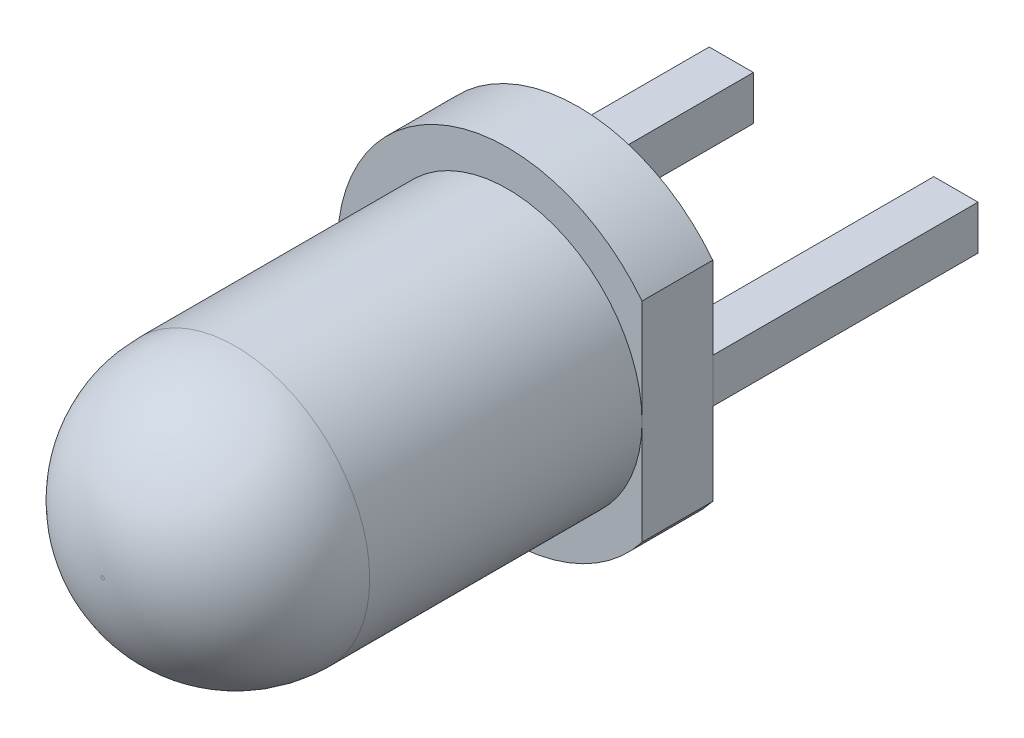
ISO-10303-21;
HEADER;
FILE_DESCRIPTION(('STEP AP214'),'2;1');
FILE_NAME('part.step','',(''),(''),'','','');
FILE_SCHEMA(('AUTOMOTIVE_DESIGN { 1 0 10303 214 1 1 1 1 }'));
ENDSEC;
DATA;
#1=APPLICATION_CONTEXT('core data for automotive mechanical design processes');
#2=APPLICATION_PROTOCOL_DEFINITION('international standard','automotive_design',2000,#1);
#3=PRODUCT_CONTEXT('',#1,'mechanical');
#4=PRODUCT('Part','Part','',(#3));
#5=PRODUCT_RELATED_PRODUCT_CATEGORY('part','',(#4));
#6=PRODUCT_DEFINITION_FORMATION('','',#4);
#7=PRODUCT_DEFINITION_CONTEXT('part definition',#1,'design');
#8=PRODUCT_DEFINITION('design','',#6,#7);
#9=PRODUCT_DEFINITION_SHAPE('','',#8);
#10=(LENGTH_UNIT() NAMED_UNIT(*) SI_UNIT(.MILLI.,.METRE.));
#11=(NAMED_UNIT(*) PLANE_ANGLE_UNIT() SI_UNIT($,.RADIAN.));
#12=(NAMED_UNIT(*) SI_UNIT($,.STERADIAN.) SOLID_ANGLE_UNIT());
#13=UNCERTAINTY_MEASURE_WITH_UNIT(LENGTH_MEASURE(1.E-05),#10,'distance_accuracy_value','');
#14=(GEOMETRIC_REPRESENTATION_CONTEXT(3) GLOBAL_UNCERTAINTY_ASSIGNED_CONTEXT((#13)) GLOBAL_UNIT_ASSIGNED_CONTEXT((#10,
#11,#12)) REPRESENTATION_CONTEXT('',''));
#15=CARTESIAN_POINT('',(0.,0.,0.));
#16=DIRECTION('',(0.,0.,1.));
#17=DIRECTION('',(1.,0.,0.));
#18=AXIS2_PLACEMENT_3D('',#15,#16,#17);
#19=CARTESIAN_POINT('',(0.,0.,5.39));
#20=DIRECTION('',(0.,0.,1.));
#21=DIRECTION('',(1.,0.,0.));
#22=AXIS2_PLACEMENT_3D('',#19,#20,#21);
#23=PLANE('',#22);
#24=CARTESIAN_POINT('',(0.,0.,5.39));
#25=DIRECTION('',(0.,0.,1.));
#26=DIRECTION('',(1.,0.,0.));
#27=AXIS2_PLACEMENT_3D('',#24,#25,#26);
#28=CIRCLE('',#27,0.02);
#29=CARTESIAN_POINT('',(0.02,0.,5.39));
#30=VERTEX_POINT('',#29);
#31=EDGE_CURVE('P0_E11',#30,#30,#28,.T.);
#32=ORIENTED_EDGE('',*,*,#31,.T.);
#33=EDGE_LOOP('',(#32));
#34=FACE_BOUND('',#33,.T.);
#35=ADVANCED_FACE('P0_F17',(#34),#23,.T.);
#36=CARTESIAN_POINT('',(1.52,0.,3.89));
#37=CARTESIAN_POINT('',(1.52,0.,4.125619449019));
#38=CARTESIAN_POINT('',(1.473746610581,0.,4.361242630973));
#39=CARTESIAN_POINT('',(1.381172946414,0.,4.584735226524));
#40=CARTESIAN_POINT('',(1.247268281961,0.,4.784052061599));
#41=CARTESIAN_POINT('',(0.914052061599,0.,5.117268281961));
#42=CARTESIAN_POINT('',(0.714735226524,0.,5.251172946414));
#43=CARTESIAN_POINT('',(0.491242630973,0.,5.343746610581));
#44=CARTESIAN_POINT('',(0.255619449019,0.,5.39));
#45=CARTESIAN_POINT('',(0.02,0.,5.39));
#46=(BOUNDED_CURVE() B_SPLINE_CURVE(5,(#36,#37,#38,#39,#40,#41,#42,#43,#44,#45),.UNSPECIFIED.,
.F.,.F.) B_SPLINE_CURVE_WITH_KNOTS((6,4,6),(0.,0.785398163397,1.570796326795),
.UNSPECIFIED.) CURVE() GEOMETRIC_REPRESENTATION_ITEM() RATIONAL_B_SPLINE_CURVE((1.,1.,1.,1.,1.,
1.,1.,1.,1.,1.)) REPRESENTATION_ITEM(''));
#47=CARTESIAN_POINT('',(0.,0.,3.89));
#48=DIRECTION('',(0.,0.,-1.));
#49=AXIS1_PLACEMENT('',#47,#48);
#50=SURFACE_OF_REVOLUTION('',#46,#49);
#51=CARTESIAN_POINT('',(0.02,0.,3.89));
#52=DIRECTION('',(0.,-1.,0.));
#53=DIRECTION('',(1.,0.,0.));
#54=AXIS2_PLACEMENT_3D('',#51,#52,#53);
#55=CIRCLE('',#54,1.5);
#56=CARTESIAN_POINT('',(1.52,0.,3.89));
#57=VERTEX_POINT('',#56);
#58=EDGE_CURVE('P0_E28',#57,#30,#55,.T.);
#59=ORIENTED_EDGE('',*,*,#58,.F.);
#60=CARTESIAN_POINT('',(0.,0.,3.89));
#61=DIRECTION('',(0.,0.,1.));
#62=DIRECTION('',(1.,0.,0.));
#63=AXIS2_PLACEMENT_3D('',#60,#61,#62);
#64=CIRCLE('',#63,1.52);
#65=EDGE_CURVE('P0_E239',#57,#57,#64,.T.);
#66=ORIENTED_EDGE('',*,*,#65,.T.);
#67=ORIENTED_EDGE('',*,*,#58,.T.);
#68=ORIENTED_EDGE('',*,*,#31,.F.);
#69=EDGE_LOOP('',(#59,#66,#67,#68));
#70=FACE_BOUND('',#69,.T.);
#71=ADVANCED_FACE('P0_F424',(#70),#50,.F.);
#72=CARTESIAN_POINT('',(0.04710743554143,0.,0.01));
#73=DIRECTION('',(0.,0.,-1.));
#74=DIRECTION('',(0.,-1.,0.));
#75=AXIS2_PLACEMENT_3D('',#72,#73,#74);
#76=PLANE('',#75);
#77=DIRECTION('',(1.,0.,0.));
#78=VECTOR('',#77,1.);
#79=CARTESIAN_POINT('',(-1.52,-0.25,0.01));
#80=LINE('',#79,#78);
#81=CARTESIAN_POINT('',(-1.52,-0.25,0.01));
#82=VERTEX_POINT('',#81);
#83=CARTESIAN_POINT('',(-1.02,-0.25,0.01));
#84=VERTEX_POINT('',#83);
#85=EDGE_CURVE('P0_E243',#82,#84,#80,.T.);
#86=ORIENTED_EDGE('',*,*,#85,.F.);
#87=DIRECTION('',(0.,-1.,0.));
#88=VECTOR('',#87,1.);
#89=CARTESIAN_POINT('',(-1.52,0.25,0.01));
#90=LINE('',#89,#88);
#91=CARTESIAN_POINT('',(-1.52,0.25,0.01));
#92=VERTEX_POINT('',#91);
#93=EDGE_CURVE('P0_E297',#92,#82,#90,.T.);
#94=ORIENTED_EDGE('',*,*,#93,.F.);
#95=DIRECTION('',(-1.,0.,0.));
#96=VECTOR('',#95,1.);
#97=CARTESIAN_POINT('',(-1.02,0.25,0.01));
#98=LINE('',#97,#96);
#99=CARTESIAN_POINT('',(-1.02,0.25,0.01));
#100=VERTEX_POINT('',#99);
#101=EDGE_CURVE('P0_E302',#100,#92,#98,.T.);
#102=ORIENTED_EDGE('',*,*,#101,.F.);
#103=DIRECTION('',(0.,1.,0.));
#104=VECTOR('',#103,1.);
#105=CARTESIAN_POINT('',(-1.02,-0.25,0.01));
#106=LINE('',#105,#104);
#107=EDGE_CURVE('P0_E284',#84,#100,#106,.T.);
#108=ORIENTED_EDGE('',*,*,#107,.F.);
#109=EDGE_LOOP('',(#86,#94,#102,#108));
#110=FACE_BOUND('',#109,.T.);
#111=ADVANCED_FACE('P0_F428',(#110),#76,.T.);
#112=CARTESIAN_POINT('',(0.,0.,0.81));
#113=DIRECTION('',(0.,0.,-1.));
#114=DIRECTION('',(1.,0.,0.));
#115=AXIS2_PLACEMENT_3D('',#112,#113,#114);
#116=CYLINDRICAL_SURFACE('',#115,1.52);
#117=CARTESIAN_POINT('',(0.,0.,0.81));
#118=DIRECTION('',(0.,0.,1.));
#119=DIRECTION('',(1.,0.,0.));
#120=AXIS2_PLACEMENT_3D('',#117,#118,#119);
#121=CIRCLE('',#120,1.52);
#122=CARTESIAN_POINT('',(1.52,0.,0.81));
#123=VERTEX_POINT('',#122);
#124=EDGE_CURVE('P0_E262',#123,#123,#121,.T.);
#125=ORIENTED_EDGE('',*,*,#124,.T.);
#126=DIRECTION('',(0.,0.,1.));
#127=VECTOR('',#126,1.);
#128=CARTESIAN_POINT('',(1.52,0.,0.81));
#129=LINE('',#128,#127);
#130=EDGE_CURVE('P0_E247',#123,#57,#129,.T.);
#131=ORIENTED_EDGE('',*,*,#130,.T.);
#132=ORIENTED_EDGE('',*,*,#65,.F.);
#133=ORIENTED_EDGE('',*,*,#130,.F.);
#134=EDGE_LOOP('',(#125,#131,#132,#133));
#135=FACE_BOUND('',#134,.T.);
#136=ADVANCED_FACE('P0_F453',(#135),#116,.T.);
#137=CARTESIAN_POINT('',(-1.52,-0.25,0.01));
#138=DIRECTION('',(0.,1.,0.));
#139=DIRECTION('',(1.,0.,0.));
#140=AXIS2_PLACEMENT_3D('',#137,#138,#139);
#141=PLANE('',#140);
#142=ORIENTED_EDGE('',*,*,#85,.T.);
#143=DIRECTION('',(0.,0.,1.));
#144=VECTOR('',#143,1.);
#145=CARTESIAN_POINT('',(-1.02,-0.25,0.01));
#146=LINE('',#145,#144);
#147=CARTESIAN_POINT('',(-1.02,-0.25,0.011));
#148=VERTEX_POINT('',#147);
#149=EDGE_CURVE('P0_E293',#84,#148,#146,.T.);
#150=ORIENTED_EDGE('',*,*,#149,.T.);
#151=DIRECTION('',(1.,0.,0.));
#152=VECTOR('',#151,1.);
#153=CARTESIAN_POINT('',(-1.52,-0.25,0.011));
#154=LINE('',#153,#152);
#155=CARTESIAN_POINT('',(-1.52,-0.25,0.011));
#156=VERTEX_POINT('',#155);
#157=EDGE_CURVE('P0_E193',#156,#148,#154,.T.);
#158=ORIENTED_EDGE('',*,*,#157,.F.);
#159=DIRECTION('',(0.,0.,1.));
#160=VECTOR('',#159,1.);
#161=CARTESIAN_POINT('',(-1.52,-0.25,0.01));
#162=LINE('',#161,#160);
#163=EDGE_CURVE('P0_E248',#82,#156,#162,.T.);
#164=ORIENTED_EDGE('',*,*,#163,.F.);
#165=EDGE_LOOP('',(#142,#150,#158,#164));
#166=FACE_BOUND('',#165,.T.);
#167=ADVANCED_FACE('P0_F479',(#166),#141,.F.);
#168=CARTESIAN_POINT('',(-1.52,0.25,0.01));
#169=DIRECTION('',(1.,0.,0.));
#170=DIRECTION('',(0.,1.,0.));
#171=AXIS2_PLACEMENT_3D('',#168,#169,#170);
#172=PLANE('',#171);
#173=ORIENTED_EDGE('',*,*,#93,.T.);
#174=ORIENTED_EDGE('',*,*,#163,.T.);
#175=DIRECTION('',(0.,-1.,0.));
#176=VECTOR('',#175,1.);
#177=CARTESIAN_POINT('',(-1.52,0.25,0.011));
#178=LINE('',#177,#176);
#179=CARTESIAN_POINT('',(-1.52,0.25,0.011));
#180=VERTEX_POINT('',#179);
#181=EDGE_CURVE('P0_E194',#180,#156,#178,.T.);
#182=ORIENTED_EDGE('',*,*,#181,.F.);
#183=DIRECTION('',(0.,0.,1.));
#184=VECTOR('',#183,1.);
#185=CARTESIAN_POINT('',(-1.52,0.25,0.01));
#186=LINE('',#185,#184);
#187=EDGE_CURVE('P0_E285',#92,#180,#186,.T.);
#188=ORIENTED_EDGE('',*,*,#187,.F.);
#189=EDGE_LOOP('',(#173,#174,#182,#188));
#190=FACE_BOUND('',#189,.T.);
#191=ADVANCED_FACE('P0_F436',(#190),#172,.F.);
#192=CARTESIAN_POINT('',(-1.02,-0.25,0.01));
#193=DIRECTION('',(-1.,0.,0.));
#194=DIRECTION('',(0.,0.,1.));
#195=AXIS2_PLACEMENT_3D('',#192,#193,#194);
#196=PLANE('',#195);
#197=ORIENTED_EDGE('',*,*,#107,.T.);
#198=DIRECTION('',(0.,0.,1.));
#199=VECTOR('',#198,1.);
#200=CARTESIAN_POINT('',(-1.02,0.25,0.01));
#201=LINE('',#200,#199);
#202=CARTESIAN_POINT('',(-1.02,0.25,0.011));
#203=VERTEX_POINT('',#202);
#204=EDGE_CURVE('P0_E56',#100,#203,#201,.T.);
#205=ORIENTED_EDGE('',*,*,#204,.T.);
#206=DIRECTION('',(0.,1.,0.));
#207=VECTOR('',#206,1.);
#208=CARTESIAN_POINT('',(-1.02,-0.25,0.011));
#209=LINE('',#208,#207);
#210=EDGE_CURVE('P0_E216',#148,#203,#209,.T.);
#211=ORIENTED_EDGE('',*,*,#210,.F.);
#212=ORIENTED_EDGE('',*,*,#149,.F.);
#213=EDGE_LOOP('',(#197,#205,#211,#212));
#214=FACE_BOUND('',#213,.T.);
#215=ADVANCED_FACE('P0_F432',(#214),#196,.F.);
#216=CARTESIAN_POINT('',(-1.02,0.25,0.01));
#217=DIRECTION('',(0.,-1.,0.));
#218=DIRECTION('',(0.,0.,-1.));
#219=AXIS2_PLACEMENT_3D('',#216,#217,#218);
#220=PLANE('',#219);
#221=ORIENTED_EDGE('',*,*,#101,.T.);
#222=ORIENTED_EDGE('',*,*,#187,.T.);
#223=DIRECTION('',(-1.,0.,0.));
#224=VECTOR('',#223,1.);
#225=CARTESIAN_POINT('',(-1.02,0.25,0.011));
#226=LINE('',#225,#224);
#227=EDGE_CURVE('P0_E254',#203,#180,#226,.T.);
#228=ORIENTED_EDGE('',*,*,#227,.F.);
#229=ORIENTED_EDGE('',*,*,#204,.F.);
#230=EDGE_LOOP('',(#221,#222,#228,#229));
#231=FACE_BOUND('',#230,.T.);
#232=ADVANCED_FACE('P0_F435',(#231),#220,.F.);
#233=CARTESIAN_POINT('',(0.04710743554143,0.,0.81));
#234=DIRECTION('',(0.,0.,-1.));
#235=DIRECTION('',(0.,-1.,0.));
#236=AXIS2_PLACEMENT_3D('',#233,#234,#235);
#237=PLANE('',#236);
#238=DIRECTION('',(0.,-1.,0.));
#239=VECTOR('',#238,1.);
#240=CARTESIAN_POINT('',(1.52,1.181196427357,0.81));
#241=LINE('',#240,#239);
#242=CARTESIAN_POINT('',(1.52,-1.181196427357,0.81));
#243=VERTEX_POINT('',#242);
#244=EDGE_CURVE('P0_E195',#123,#243,#241,.T.);
#245=ORIENTED_EDGE('',*,*,#244,.F.);
#246=ORIENTED_EDGE('',*,*,#124,.F.);
#247=DIRECTION('',(0.,-1.,0.));
#248=VECTOR('',#247,1.);
#249=CARTESIAN_POINT('',(1.52,1.181196427357,0.81));
#250=LINE('',#249,#248);
#251=CARTESIAN_POINT('',(1.52,1.181196427357,0.81));
#252=VERTEX_POINT('',#251);
#253=EDGE_CURVE('P0_E200',#252,#123,#250,.T.);
#254=ORIENTED_EDGE('',*,*,#253,.F.);
#255=CARTESIAN_POINT('',(0.,0.,0.81));
#256=DIRECTION('',(0.,0.,1.));
#257=DIRECTION('',(1.,0.,0.));
#258=AXIS2_PLACEMENT_3D('',#255,#256,#257);
#259=CIRCLE('',#258,1.925);
#260=EDGE_CURVE('P0_E235',#252,#243,#259,.T.);
#261=ORIENTED_EDGE('',*,*,#260,.T.);
#262=EDGE_LOOP('',(#245,#246,#254,#261));
#263=FACE_BOUND('',#262,.T.);
#264=ADVANCED_FACE('P0_F460',(#263),#237,.F.);
#265=CARTESIAN_POINT('',(-1.52,-0.349,0.011));
#266=DIRECTION('',(1.,0.,0.));
#267=DIRECTION('',(0.,0.,1.));
#268=AXIS2_PLACEMENT_3D('',#265,#266,#267);
#269=CYLINDRICAL_SURFACE('',#268,0.099);
#270=CARTESIAN_POINT('',(-1.619,-0.349,0.011));
#271=DIRECTION('',(-0.707106781186548,0.707106781186548,0.));
#272=DIRECTION('',(0.707106781186548,0.707106781186548,0.));
#273=AXIS2_PLACEMENT_3D('',#270,#271,#272);
#274=ELLIPSE('',#273,0.140007142675,0.099);
#275=CARTESIAN_POINT('',(-1.619,-0.349,0.11));
#276=VERTEX_POINT('',#275);
#277=EDGE_CURVE('P0_E189',#276,#156,#274,.T.);
#278=ORIENTED_EDGE('',*,*,#277,.T.);
#279=ORIENTED_EDGE('',*,*,#157,.T.);
#280=CARTESIAN_POINT('',(-0.921,-0.349,0.011));
#281=DIRECTION('',(-0.707106781186548,-0.707106781186548,0.));
#282=DIRECTION('',(-0.707106781186548,0.707106781186548,0.));
#283=AXIS2_PLACEMENT_3D('',#280,#281,#282);
#284=ELLIPSE('',#283,0.140007142675,0.099);
#285=CARTESIAN_POINT('',(-0.921,-0.349,0.11));
#286=VERTEX_POINT('',#285);
#287=EDGE_CURVE('P0_E209',#286,#148,#284,.T.);
#288=ORIENTED_EDGE('',*,*,#287,.F.);
#289=DIRECTION('',(1.,0.,0.));
#290=VECTOR('',#289,1.);
#291=CARTESIAN_POINT('',(-1.52,-0.349,0.11));
#292=LINE('',#291,#290);
#293=EDGE_CURVE('P0_E267',#276,#286,#292,.T.);
#294=ORIENTED_EDGE('',*,*,#293,.F.);
#295=EDGE_LOOP('',(#278,#279,#288,#294));
#296=FACE_BOUND('',#295,.T.);
#297=ADVANCED_FACE('P0_F457',(#296),#269,.F.);
#298=CARTESIAN_POINT('',(-1.619,0.25,0.011));
#299=DIRECTION('',(0.,-1.,0.));
#300=DIRECTION('',(0.,0.,1.));
#301=AXIS2_PLACEMENT_3D('',#298,#299,#300);
#302=CYLINDRICAL_SURFACE('',#301,0.099);
#303=CARTESIAN_POINT('',(-1.619,0.349,0.011));
#304=DIRECTION('',(0.707106781186548,0.707106781186548,0.));
#305=DIRECTION('',(-0.707106781186548,0.707106781186548,0.));
#306=AXIS2_PLACEMENT_3D('',#303,#304,#305);
#307=ELLIPSE('',#306,0.140007142675,0.099);
#308=CARTESIAN_POINT('',(-1.619,0.349,0.11));
#309=VERTEX_POINT('',#308);
#310=EDGE_CURVE('P0_E217',#309,#180,#307,.T.);
#311=ORIENTED_EDGE('',*,*,#310,.T.);
#312=ORIENTED_EDGE('',*,*,#181,.T.);
#313=ORIENTED_EDGE('',*,*,#277,.F.);
#314=DIRECTION('',(0.,-1.,0.));
#315=VECTOR('',#314,1.);
#316=CARTESIAN_POINT('',(-1.619,0.25,0.11));
#317=LINE('',#316,#315);
#318=EDGE_CURVE('P0_E271',#309,#276,#317,.T.);
#319=ORIENTED_EDGE('',*,*,#318,.F.);
#320=EDGE_LOOP('',(#311,#312,#313,#319));
#321=FACE_BOUND('',#320,.T.);
#322=ADVANCED_FACE('P0_F19',(#321),#302,.F.);
#323=CARTESIAN_POINT('',(-0.921,-0.25,0.011));
#324=DIRECTION('',(0.,1.,0.));
#325=DIRECTION('',(0.,0.,1.));
#326=AXIS2_PLACEMENT_3D('',#323,#324,#325);
#327=CYLINDRICAL_SURFACE('',#326,0.099);
#328=ORIENTED_EDGE('',*,*,#287,.T.);
#329=ORIENTED_EDGE('',*,*,#210,.T.);
#330=CARTESIAN_POINT('',(-0.921,0.349,0.011));
#331=DIRECTION('',(0.707106781186548,-0.707106781186548,0.));
#332=DIRECTION('',(-0.707106781186548,-0.707106781186548,0.));
#333=AXIS2_PLACEMENT_3D('',#330,#331,#332);
#334=ELLIPSE('',#333,0.140007142675,0.099);
#335=CARTESIAN_POINT('',(-0.921,0.349,0.11));
#336=VERTEX_POINT('',#335);
#337=EDGE_CURVE('P0_E258',#336,#203,#334,.T.);
#338=ORIENTED_EDGE('',*,*,#337,.F.);
#339=DIRECTION('',(0.,1.,0.));
#340=VECTOR('',#339,1.);
#341=CARTESIAN_POINT('',(-0.921,-0.25,0.11));
#342=LINE('',#341,#340);
#343=EDGE_CURVE('P0_E21',#286,#336,#342,.T.);
#344=ORIENTED_EDGE('',*,*,#343,.F.);
#345=EDGE_LOOP('',(#328,#329,#338,#344));
#346=FACE_BOUND('',#345,.T.);
#347=ADVANCED_FACE('P0_F475',(#346),#327,.F.);
#348=CARTESIAN_POINT('',(-1.02,0.349,0.011));
#349=DIRECTION('',(-1.,0.,0.));
#350=DIRECTION('',(0.,0.,1.));
#351=AXIS2_PLACEMENT_3D('',#348,#349,#350);
#352=CYLINDRICAL_SURFACE('',#351,0.099);
#353=ORIENTED_EDGE('',*,*,#337,.T.);
#354=ORIENTED_EDGE('',*,*,#227,.T.);
#355=ORIENTED_EDGE('',*,*,#310,.F.);
#356=DIRECTION('',(-1.,0.,0.));
#357=VECTOR('',#356,1.);
#358=CARTESIAN_POINT('',(-1.02,0.349,0.11));
#359=LINE('',#358,#357);
#360=EDGE_CURVE('P0_E272',#336,#309,#359,.T.);
#361=ORIENTED_EDGE('',*,*,#360,.F.);
#362=EDGE_LOOP('',(#353,#354,#355,#361));
#363=FACE_BOUND('',#362,.T.);
#364=ADVANCED_FACE('P0_F469',(#363),#352,.F.);
#365=CARTESIAN_POINT('',(0.921,-0.25,0.011));
#366=DIRECTION('',(0.,1.,0.));
#367=DIRECTION('',(1.,0.,0.));
#368=AXIS2_PLACEMENT_3D('',#365,#366,#367);
#369=CYLINDRICAL_SURFACE('',#368,0.099);
#370=CARTESIAN_POINT('',(0.921,-0.349,0.011));
#371=DIRECTION('',(0.707106781186548,-0.707106781186548,0.));
#372=DIRECTION('',(0.707106781186548,0.707106781186548,0.));
#373=AXIS2_PLACEMENT_3D('',#370,#371,#372);
#374=ELLIPSE('',#373,0.140007142675,0.099);
#375=CARTESIAN_POINT('',(1.02,-0.25,0.011));
#376=VERTEX_POINT('',#375);
#377=CARTESIAN_POINT('',(0.921,-0.349,0.11));
#378=VERTEX_POINT('',#377);
#379=EDGE_CURVE('P0_E263',#376,#378,#374,.T.);
#380=ORIENTED_EDGE('',*,*,#379,.T.);
#381=DIRECTION('',(0.,1.,0.));
#382=VECTOR('',#381,1.);
#383=CARTESIAN_POINT('',(0.921,-0.25,0.11));
#384=LINE('',#383,#382);
#385=CARTESIAN_POINT('',(0.921,0.349,0.11));
#386=VERTEX_POINT('',#385);
#387=EDGE_CURVE('P0_E358',#378,#386,#384,.T.);
#388=ORIENTED_EDGE('',*,*,#387,.T.);
#389=CARTESIAN_POINT('',(0.921,0.349,0.011));
#390=DIRECTION('',(-0.707106781186548,-0.707106781186548,0.));
#391=DIRECTION('',(-0.707106781186548,0.707106781186548,0.));
#392=AXIS2_PLACEMENT_3D('',#389,#390,#391);
#393=ELLIPSE('',#392,0.140007142675,0.099);
#394=CARTESIAN_POINT('',(1.02,0.25,0.011));
#395=VERTEX_POINT('',#394);
#396=EDGE_CURVE('P0_E72',#395,#386,#393,.T.);
#397=ORIENTED_EDGE('',*,*,#396,.F.);
#398=DIRECTION('',(0.,1.,0.));
#399=VECTOR('',#398,1.);
#400=CARTESIAN_POINT('',(1.02,-0.25,0.011));
#401=LINE('',#400,#399);
#402=EDGE_CURVE('P0_E266',#376,#395,#401,.T.);
#403=ORIENTED_EDGE('',*,*,#402,.F.);
#404=EDGE_LOOP('',(#380,#388,#397,#403));
#405=FACE_BOUND('',#404,.T.);
#406=ADVANCED_FACE('P0_F466',(#405),#369,.F.);
#407=CARTESIAN_POINT('',(1.02,0.349,0.011));
#408=DIRECTION('',(1.,0.,0.));
#409=DIRECTION('',(0.,-1.,0.));
#410=AXIS2_PLACEMENT_3D('',#407,#408,#409);
#411=CYLINDRICAL_SURFACE('',#410,0.099);
#412=ORIENTED_EDGE('',*,*,#396,.T.);
#413=DIRECTION('',(1.,0.,0.));
#414=VECTOR('',#413,1.);
#415=CARTESIAN_POINT('',(1.02,0.349,0.11));
#416=LINE('',#415,#414);
#417=CARTESIAN_POINT('',(1.321,0.349,0.11));
#418=VERTEX_POINT('',#417);
#419=EDGE_CURVE('P0_E187',#386,#418,#416,.T.);
#420=ORIENTED_EDGE('',*,*,#419,.T.);
#421=CARTESIAN_POINT('',(1.321,0.349,0.011));
#422=DIRECTION('',(-0.707106781186548,-0.707106781186548,0.));
#423=DIRECTION('',(-0.707106781186548,0.707106781186548,0.));
#424=AXIS2_PLACEMENT_3D('',#421,#422,#423);
#425=ELLIPSE('',#424,0.140007142675,0.099);
#426=CARTESIAN_POINT('',(1.42,0.25,0.011));
#427=VERTEX_POINT('',#426);
#428=EDGE_CURVE('P0_E281',#427,#418,#425,.T.);
#429=ORIENTED_EDGE('',*,*,#428,.F.);
#430=DIRECTION('',(1.,0.,0.));
#431=VECTOR('',#430,1.);
#432=CARTESIAN_POINT('',(1.02,0.25,0.011));
#433=LINE('',#432,#431);
#434=EDGE_CURVE('P0_E234',#395,#427,#433,.T.);
#435=ORIENTED_EDGE('',*,*,#434,.F.);
#436=EDGE_LOOP('',(#412,#420,#429,#435));
#437=FACE_BOUND('',#436,.T.);
#438=ADVANCED_FACE('P0_F444',(#437),#411,.F.);
#439=CARTESIAN_POINT('',(1.42,-0.349,0.011));
#440=DIRECTION('',(-1.,0.,0.));
#441=DIRECTION('',(0.,1.,0.));
#442=AXIS2_PLACEMENT_3D('',#439,#440,#441);
#443=CYLINDRICAL_SURFACE('',#442,0.099);
#444=CARTESIAN_POINT('',(1.321,-0.349,0.011));
#445=DIRECTION('',(0.707106781186548,-0.707106781186548,0.));
#446=DIRECTION('',(0.707106781186548,0.707106781186548,0.));
#447=AXIS2_PLACEMENT_3D('',#444,#445,#446);
#448=ELLIPSE('',#447,0.140007142675,0.099);
#449=CARTESIAN_POINT('',(1.42,-0.25,0.011));
#450=VERTEX_POINT('',#449);
#451=CARTESIAN_POINT('',(1.321,-0.349,0.11));
#452=VERTEX_POINT('',#451);
#453=EDGE_CURVE('P0_E249',#450,#452,#448,.T.);
#454=ORIENTED_EDGE('',*,*,#453,.T.);
#455=DIRECTION('',(-1.,0.,0.));
#456=VECTOR('',#455,1.);
#457=CARTESIAN_POINT('',(1.42,-0.349,0.11));
#458=LINE('',#457,#456);
#459=EDGE_CURVE('P0_E276',#452,#378,#458,.T.);
#460=ORIENTED_EDGE('',*,*,#459,.T.);
#461=ORIENTED_EDGE('',*,*,#379,.F.);
#462=DIRECTION('',(-1.,0.,0.));
#463=VECTOR('',#462,1.);
#464=CARTESIAN_POINT('',(1.42,-0.25,0.011));
#465=LINE('',#464,#463);
#466=EDGE_CURVE('P0_E253',#450,#376,#465,.T.);
#467=ORIENTED_EDGE('',*,*,#466,.F.);
#468=EDGE_LOOP('',(#454,#460,#461,#467));
#469=FACE_BOUND('',#468,.T.);
#470=ADVANCED_FACE('P0_F319',(#469),#443,.F.);
#471=CARTESIAN_POINT('',(1.02,-0.25,0.01));
#472=DIRECTION('',(-1.,0.,0.));
#473=DIRECTION('',(0.,0.,1.));
#474=AXIS2_PLACEMENT_3D('',#471,#472,#473);
#475=PLANE('',#474);
#476=DIRECTION('',(0.,0.,1.));
#477=VECTOR('',#476,1.);
#478=CARTESIAN_POINT('',(1.02,-0.25,0.01));
#479=LINE('',#478,#477);
#480=CARTESIAN_POINT('',(1.02,-0.25,0.01));
#481=VERTEX_POINT('',#480);
#482=EDGE_CURVE('P0_E289',#481,#376,#479,.T.);
#483=ORIENTED_EDGE('',*,*,#482,.T.);
#484=ORIENTED_EDGE('',*,*,#402,.T.);
#485=DIRECTION('',(0.,0.,1.));
#486=VECTOR('',#485,1.);
#487=CARTESIAN_POINT('',(1.02,0.25,0.01));
#488=LINE('',#487,#486);
#489=CARTESIAN_POINT('',(1.02,0.25,0.01));
#490=VERTEX_POINT('',#489);
#491=EDGE_CURVE('P0_E230',#490,#395,#488,.T.);
#492=ORIENTED_EDGE('',*,*,#491,.F.);
#493=DIRECTION('',(0.,1.,0.));
#494=VECTOR('',#493,1.);
#495=CARTESIAN_POINT('',(1.02,-0.25,0.01));
#496=LINE('',#495,#494);
#497=EDGE_CURVE('P0_E222',#481,#490,#496,.T.);
#498=ORIENTED_EDGE('',*,*,#497,.F.);
#499=EDGE_LOOP('',(#483,#484,#492,#498));
#500=FACE_BOUND('',#499,.T.);
#501=ADVANCED_FACE('P0_F309',(#500),#475,.T.);
#502=CARTESIAN_POINT('',(1.02,0.25,0.01));
#503=DIRECTION('',(0.,1.,0.));
#504=DIRECTION('',(1.,0.,0.));
#505=AXIS2_PLACEMENT_3D('',#502,#503,#504);
#506=PLANE('',#505);
#507=ORIENTED_EDGE('',*,*,#491,.T.);
#508=ORIENTED_EDGE('',*,*,#434,.T.);
#509=DIRECTION('',(0.,0.,1.));
#510=VECTOR('',#509,1.);
#511=CARTESIAN_POINT('',(1.42,0.25,0.01));
#512=LINE('',#511,#510);
#513=CARTESIAN_POINT('',(1.42,0.25,0.01));
#514=VERTEX_POINT('',#513);
#515=EDGE_CURVE('P0_E163',#514,#427,#512,.T.);
#516=ORIENTED_EDGE('',*,*,#515,.F.);
#517=DIRECTION('',(1.,0.,0.));
#518=VECTOR('',#517,1.);
#519=CARTESIAN_POINT('',(1.02,0.25,0.01));
#520=LINE('',#519,#518);
#521=EDGE_CURVE('P0_E159',#490,#514,#520,.T.);
#522=ORIENTED_EDGE('',*,*,#521,.F.);
#523=EDGE_LOOP('',(#507,#508,#516,#522));
#524=FACE_BOUND('',#523,.T.);
#525=ADVANCED_FACE('P0_F430',(#524),#506,.T.);
#526=CARTESIAN_POINT('',(0.,0.,0.01));
#527=DIRECTION('',(0.,0.,-1.));
#528=DIRECTION('',(1.,0.,0.));
#529=AXIS2_PLACEMENT_3D('',#526,#527,#528);
#530=CYLINDRICAL_SURFACE('',#529,1.925);
#531=CARTESIAN_POINT('',(0.,0.,0.01));
#532=DIRECTION('',(0.,0.,1.));
#533=DIRECTION('',(1.,0.,0.));
#534=AXIS2_PLACEMENT_3D('',#531,#532,#533);
#535=CIRCLE('',#534,1.925);
#536=CARTESIAN_POINT('',(1.52,1.181196427357,0.01));
#537=VERTEX_POINT('',#536);
#538=CARTESIAN_POINT('',(1.52,-1.181196427357,0.01));
#539=VERTEX_POINT('',#538);
#540=EDGE_CURVE('P0_E223',#537,#539,#535,.T.);
#541=ORIENTED_EDGE('',*,*,#540,.T.);
#542=DIRECTION('',(0.,0.,1.));
#543=VECTOR('',#542,1.);
#544=CARTESIAN_POINT('',(1.52,-1.181196427357,0.01));
#545=LINE('',#544,#543);
#546=EDGE_CURVE('P0_E199',#539,#243,#545,.T.);
#547=ORIENTED_EDGE('',*,*,#546,.T.);
#548=ORIENTED_EDGE('',*,*,#260,.F.);
#549=DIRECTION('',(0.,0.,1.));
#550=VECTOR('',#549,1.);
#551=CARTESIAN_POINT('',(1.52,1.181196427357,0.01));
#552=LINE('',#551,#550);
#553=EDGE_CURVE('P0_E277',#537,#252,#552,.T.);
#554=ORIENTED_EDGE('',*,*,#553,.F.);
#555=EDGE_LOOP('',(#541,#547,#548,#554));
#556=FACE_BOUND('',#555,.T.);
#557=ADVANCED_FACE('P0_F449',(#556),#530,.T.);
#558=CARTESIAN_POINT('',(1.52,1.181196427357,0.01));
#559=DIRECTION('',(1.,0.,0.));
#560=DIRECTION('',(0.,1.,0.));
#561=AXIS2_PLACEMENT_3D('',#558,#559,#560);
#562=PLANE('',#561);
#563=ORIENTED_EDGE('',*,*,#553,.T.);
#564=ORIENTED_EDGE('',*,*,#253,.T.);
#565=ORIENTED_EDGE('',*,*,#244,.T.);
#566=ORIENTED_EDGE('',*,*,#546,.F.);
#567=DIRECTION('',(0.,-1.,0.));
#568=VECTOR('',#567,1.);
#569=CARTESIAN_POINT('',(1.52,1.181196427357,0.01));
#570=LINE('',#569,#568);
#571=EDGE_CURVE('P0_E343',#537,#539,#570,.T.);
#572=ORIENTED_EDGE('',*,*,#571,.F.);
#573=EDGE_LOOP('',(#563,#564,#565,#566,#572));
#574=FACE_BOUND('',#573,.T.);
#575=ADVANCED_FACE('P0_F445',(#574),#562,.T.);
#576=CARTESIAN_POINT('',(1.321,0.25,0.011));
#577=DIRECTION('',(0.,1.,0.));
#578=DIRECTION('',(1.,0.,0.));
#579=AXIS2_PLACEMENT_3D('',#576,#577,#578);
#580=CYLINDRICAL_SURFACE('',#579,0.099);
#581=ORIENTED_EDGE('',*,*,#428,.T.);
#582=DIRECTION('',(0.,1.,0.));
#583=VECTOR('',#582,1.);
#584=CARTESIAN_POINT('',(1.321,0.25,0.11));
#585=LINE('',#584,#583);
#586=CARTESIAN_POINT('',(1.321,1.110871279672,0.11));
#587=VERTEX_POINT('',#586);
#588=EDGE_CURVE('P0_E290',#418,#587,#585,.T.);
#589=ORIENTED_EDGE('',*,*,#588,.T.);
#590=CARTESIAN_POINT('',(1.42,1.146396528257,0.011));
#591=CARTESIAN_POINT('',(1.419999998987,1.146396526287,0.03125876072404));
#592=CARTESIAN_POINT('',(1.415163403371,1.14468787317,0.05151873587734));
#593=CARTESIAN_POINT('',(1.405489350111,1.141270101434,0.07039024741974));
#594=CARTESIAN_POINT('',(1.391478382053,1.136304591358,0.08648439233626));
#595=CARTESIAN_POINT('',(1.374130100074,1.130110658325,0.09866255670713));
#596=CARTESIAN_POINT('',(1.354746788412,1.123130825513,0.10624687926518));
#597=CARTESIAN_POINT('',(1.332753388435,1.115148305203,0.10931943723926));
#598=CARTESIAN_POINT('',(1.330802867535,1.114439841167,0.10954607495158));
#599=CARTESIAN_POINT('',(1.32884732283,1.11372902605,0.10972755842079));
#600=CARTESIAN_POINT('',(1.326888006457,1.113016309057,0.10986375763367));
#601=CARTESIAN_POINT('',(1.324926174052,1.112302142017,0.10995458593684));
#602=CARTESIAN_POINT('',(1.322963084756,1.111586979382,0.110000000037));
#603=CARTESIAN_POINT('',(1.321000001212,1.110871278231,0.11));
#604=(BOUNDED_CURVE() B_SPLINE_CURVE(7,(#590,#591,#592,#593,#594,#595,#596,#597,#598,#599,#600,
#601,#602,#603),.UNSPECIFIED.,.F.,.F.) B_SPLINE_CURVE_WITH_KNOTS((8,6,8),(0.,0.911598549296,1.),
.UNSPECIFIED.) CURVE() GEOMETRIC_REPRESENTATION_ITEM() RATIONAL_B_SPLINE_CURVE((1.,1.,1.,1.,1.,
1.,1.,1.,1.,1.,1.,1.,1.,1.)) REPRESENTATION_ITEM(''));
#605=CARTESIAN_POINT('',(1.42,1.146396528257,0.011));
#606=VERTEX_POINT('',#605);
#607=EDGE_CURVE('P0_E201',#606,#587,#604,.T.);
#608=ORIENTED_EDGE('',*,*,#607,.F.);
#609=DIRECTION('',(0.,1.,0.));
#610=VECTOR('',#609,1.);
#611=CARTESIAN_POINT('',(1.42,0.25,0.011));
#612=LINE('',#611,#610);
#613=EDGE_CURVE('P0_E169',#427,#606,#612,.T.);
#614=ORIENTED_EDGE('',*,*,#613,.F.);
#615=EDGE_LOOP('',(#581,#589,#608,#614));
#616=FACE_BOUND('',#615,.T.);
#617=ADVANCED_FACE('P0_F448',(#616),#580,.F.);
#618=CARTESIAN_POINT('',(0.106221193918,0.,0.11));
#619=DIRECTION('',(0.,0.,-1.));
#620=DIRECTION('',(0.,-1.,0.));
#621=AXIS2_PLACEMENT_3D('',#618,#619,#620);
#622=PLANE('',#621);
#623=ORIENTED_EDGE('',*,*,#360,.T.);
#624=ORIENTED_EDGE('',*,*,#318,.T.);
#625=ORIENTED_EDGE('',*,*,#293,.T.);
#626=ORIENTED_EDGE('',*,*,#343,.T.);
#627=EDGE_LOOP('',(#623,#624,#625,#626));
#628=FACE_BOUND('',#627,.T.);
#629=CARTESIAN_POINT('',(0.,0.,0.11));
#630=DIRECTION('',(0.,0.,-1.));
#631=DIRECTION('',(0.778082191780786,-0.628162481236828,0.));
#632=AXIS2_PLACEMENT_3D('',#629,#630,#631);
#633=CIRCLE('',#632,1.726);
#634=CARTESIAN_POINT('',(1.321,-1.110871279672,0.11));
#635=VERTEX_POINT('',#634);
#636=EDGE_CURVE('P0_E207',#635,#587,#633,.T.);
#637=ORIENTED_EDGE('',*,*,#636,.T.);
#638=ORIENTED_EDGE('',*,*,#588,.F.);
#639=ORIENTED_EDGE('',*,*,#419,.F.);
#640=ORIENTED_EDGE('',*,*,#387,.F.);
#641=ORIENTED_EDGE('',*,*,#459,.F.);
#642=DIRECTION('',(0.,1.,0.));
#643=VECTOR('',#642,1.);
#644=CARTESIAN_POINT('',(1.321,-1.146396528257,0.11));
#645=LINE('',#644,#643);
#646=EDGE_CURVE('P0_E229',#635,#452,#645,.T.);
#647=ORIENTED_EDGE('',*,*,#646,.F.);
#648=EDGE_LOOP('',(#637,#638,#639,#640,#641,#647));
#649=FACE_BOUND('',#648,.T.);
#650=ADVANCED_FACE('P0_F502',(#628,#649),#622,.T.);
#651=CARTESIAN_POINT('',(1.42,-0.25,0.01));
#652=DIRECTION('',(0.,-1.,0.));
#653=DIRECTION('',(0.,0.,-1.));
#654=AXIS2_PLACEMENT_3D('',#651,#652,#653);
#655=PLANE('',#654);
#656=DIRECTION('',(0.,0.,1.));
#657=VECTOR('',#656,1.);
#658=CARTESIAN_POINT('',(1.42,-0.25,0.01));
#659=LINE('',#658,#657);
#660=CARTESIAN_POINT('',(1.42,-0.25,0.01));
#661=VERTEX_POINT('',#660);
#662=EDGE_CURVE('P0_E315',#661,#450,#659,.T.);
#663=ORIENTED_EDGE('',*,*,#662,.T.);
#664=ORIENTED_EDGE('',*,*,#466,.T.);
#665=ORIENTED_EDGE('',*,*,#482,.F.);
#666=DIRECTION('',(-1.,0.,0.));
#667=VECTOR('',#666,1.);
#668=CARTESIAN_POINT('',(1.42,-0.25,0.01));
#669=LINE('',#668,#667);
#670=EDGE_CURVE('P0_E218',#661,#481,#669,.T.);
#671=ORIENTED_EDGE('',*,*,#670,.F.);
#672=EDGE_LOOP('',(#663,#664,#665,#671));
#673=FACE_BOUND('',#672,.T.);
#674=ADVANCED_FACE('P0_F313',(#673),#655,.T.);
#675=CARTESIAN_POINT('',(1.321,-1.146396528257,0.011));
#676=DIRECTION('',(0.,1.,0.));
#677=DIRECTION('',(1.,0.,0.));
#678=AXIS2_PLACEMENT_3D('',#675,#676,#677);
#679=CYLINDRICAL_SURFACE('',#678,0.099);
#680=CARTESIAN_POINT('',(1.42,-1.146396528257,0.011));
#681=CARTESIAN_POINT('',(1.419999998889,-1.146396526096,0.03322318387792));
#682=CARTESIAN_POINT('',(1.414179941378,-1.144340442402,0.05544795657592));
#683=CARTESIAN_POINT('',(1.402538606567,-1.140227613385,0.07584018826717));
#684=CARTESIAN_POINT('',(1.385800418067,-1.134291663529,0.09256529242793));
#685=CARTESIAN_POINT('',(1.365414407119,-1.126995015846,0.10418858395967));
#686=CARTESIAN_POINT('',(1.343206372936,-1.118967243934,0.110000040068));
#687=CARTESIAN_POINT('',(1.320999999937,-1.110871279747,0.11));
#688=(BOUNDED_CURVE() B_SPLINE_CURVE(7,(#680,#681,#682,#683,#684,#685,#686,#687),.UNSPECIFIED.,
.F.,.F.) B_SPLINE_CURVE_WITH_KNOTS((8,8),(0.,1.),
.UNSPECIFIED.) CURVE() GEOMETRIC_REPRESENTATION_ITEM() RATIONAL_B_SPLINE_CURVE((1.,1.,1.,1.,1.,
1.,1.,1.)) REPRESENTATION_ITEM(''));
#689=CARTESIAN_POINT('',(1.42,-1.146396528257,0.011));
#690=VERTEX_POINT('',#689);
#691=EDGE_CURVE('P0_E208',#690,#635,#688,.T.);
#692=ORIENTED_EDGE('',*,*,#691,.T.);
#693=ORIENTED_EDGE('',*,*,#646,.T.);
#694=ORIENTED_EDGE('',*,*,#453,.F.);
#695=DIRECTION('',(0.,1.,0.));
#696=VECTOR('',#695,1.);
#697=CARTESIAN_POINT('',(1.42,-1.146396528257,0.011));
#698=LINE('',#697,#696);
#699=EDGE_CURVE('P0_E326',#690,#450,#698,.T.);
#700=ORIENTED_EDGE('',*,*,#699,.F.);
#701=EDGE_LOOP('',(#692,#693,#694,#700));
#702=FACE_BOUND('',#701,.T.);
#703=ADVANCED_FACE('P0_F325',(#702),#679,.F.);
#704=CARTESIAN_POINT('',(1.42,0.25,0.01));
#705=DIRECTION('',(-1.,0.,0.));
#706=DIRECTION('',(0.,0.,1.));
#707=AXIS2_PLACEMENT_3D('',#704,#705,#706);
#708=PLANE('',#707);
#709=ORIENTED_EDGE('',*,*,#515,.T.);
#710=ORIENTED_EDGE('',*,*,#613,.T.);
#711=DIRECTION('',(0.,0.,1.));
#712=VECTOR('',#711,1.);
#713=CARTESIAN_POINT('',(1.42,1.146396528257,0.01));
#714=LINE('',#713,#712);
#715=CARTESIAN_POINT('',(1.42,1.146396528257,0.01));
#716=VERTEX_POINT('',#715);
#717=EDGE_CURVE('P0_E166',#716,#606,#714,.T.);
#718=ORIENTED_EDGE('',*,*,#717,.F.);
#719=DIRECTION('',(0.,1.,0.));
#720=VECTOR('',#719,1.);
#721=CARTESIAN_POINT('',(1.42,0.25,0.01));
#722=LINE('',#721,#720);
#723=EDGE_CURVE('P0_E150',#514,#716,#722,.T.);
#724=ORIENTED_EDGE('',*,*,#723,.F.);
#725=EDGE_LOOP('',(#709,#710,#718,#724));
#726=FACE_BOUND('',#725,.T.);
#727=ADVANCED_FACE('P0_F167',(#726),#708,.T.);
#728=CARTESIAN_POINT('',(0.04710743554143,0.,0.01));
#729=DIRECTION('',(0.,0.,-1.));
#730=DIRECTION('',(0.,-1.,0.));
#731=AXIS2_PLACEMENT_3D('',#728,#729,#730);
#732=PLANE('',#731);
#733=CARTESIAN_POINT('',(0.,0.,0.01));
#734=DIRECTION('',(0.,0.,-1.));
#735=DIRECTION('',(1.,0.,0.));
#736=AXIS2_PLACEMENT_3D('',#733,#734,#735);
#737=CIRCLE('',#736,1.825);
#738=CARTESIAN_POINT('',(1.42,-1.146396528257,0.01));
#739=VERTEX_POINT('',#738);
#740=EDGE_CURVE('P0_E156',#739,#716,#737,.T.);
#741=ORIENTED_EDGE('',*,*,#740,.F.);
#742=DIRECTION('',(0.,1.,0.));
#743=VECTOR('',#742,1.);
#744=CARTESIAN_POINT('',(1.42,-1.146396528257,0.01));
#745=LINE('',#744,#743);
#746=EDGE_CURVE('P0_E352',#739,#661,#745,.T.);
#747=ORIENTED_EDGE('',*,*,#746,.T.);
#748=ORIENTED_EDGE('',*,*,#670,.T.);
#749=ORIENTED_EDGE('',*,*,#497,.T.);
#750=ORIENTED_EDGE('',*,*,#521,.T.);
#751=ORIENTED_EDGE('',*,*,#723,.T.);
#752=EDGE_LOOP('',(#741,#747,#748,#749,#750,#751));
#753=FACE_BOUND('',#752,.T.);
#754=ORIENTED_EDGE('',*,*,#571,.T.);
#755=ORIENTED_EDGE('',*,*,#540,.F.);
#756=EDGE_LOOP('',(#754,#755));
#757=FACE_BOUND('',#756,.T.);
#758=ADVANCED_FACE('P0_F152',(#753,#757),#732,.T.);
#759=CARTESIAN_POINT('',(0.,0.,0.011));
#760=DIRECTION('',(0.,0.,1.));
#761=DIRECTION('',(0.778082191780786,-0.628162481236828,0.));
#762=AXIS2_PLACEMENT_3D('',#759,#760,#761);
#763=TOROIDAL_SURFACE('',#762,1.726,0.099);
#764=ORIENTED_EDGE('',*,*,#691,.F.);
#765=CARTESIAN_POINT('',(0.,0.,0.011));
#766=DIRECTION('',(0.,0.,-1.));
#767=DIRECTION('',(0.778082191780786,-0.628162481236828,0.));
#768=AXIS2_PLACEMENT_3D('',#765,#766,#767);
#769=CIRCLE('',#768,1.825);
#770=EDGE_CURVE('P0_E174',#690,#606,#769,.T.);
#771=ORIENTED_EDGE('',*,*,#770,.T.);
#772=ORIENTED_EDGE('',*,*,#607,.T.);
#773=ORIENTED_EDGE('',*,*,#636,.F.);
#774=EDGE_LOOP('',(#764,#771,#772,#773));
#775=FACE_BOUND('',#774,.T.);
#776=ADVANCED_FACE('P0_F437',(#775),#763,.F.);
#777=CARTESIAN_POINT('',(1.42,-1.146396528257,0.01));
#778=DIRECTION('',(-1.,0.,0.));
#779=DIRECTION('',(0.,0.,1.));
#780=AXIS2_PLACEMENT_3D('',#777,#778,#779);
#781=PLANE('',#780);
#782=DIRECTION('',(0.,0.,1.));
#783=VECTOR('',#782,1.);
#784=CARTESIAN_POINT('',(1.42,-1.146396528257,0.01));
#785=LINE('',#784,#783);
#786=EDGE_CURVE('P0_E179',#739,#690,#785,.T.);
#787=ORIENTED_EDGE('',*,*,#786,.T.);
#788=ORIENTED_EDGE('',*,*,#699,.T.);
#789=ORIENTED_EDGE('',*,*,#662,.F.);
#790=ORIENTED_EDGE('',*,*,#746,.F.);
#791=EDGE_LOOP('',(#787,#788,#789,#790));
#792=FACE_BOUND('',#791,.T.);
#793=ADVANCED_FACE('P0_F440',(#792),#781,.T.);
#794=CARTESIAN_POINT('',(0.,0.,0.01));
#795=DIRECTION('',(0.,0.,-1.));
#796=DIRECTION('',(1.,0.,0.));
#797=AXIS2_PLACEMENT_3D('',#794,#795,#796);
#798=CYLINDRICAL_SURFACE('',#797,1.825);
#799=ORIENTED_EDGE('',*,*,#740,.T.);
#800=ORIENTED_EDGE('',*,*,#717,.T.);
#801=ORIENTED_EDGE('',*,*,#770,.F.);
#802=ORIENTED_EDGE('',*,*,#786,.F.);
#803=EDGE_LOOP('',(#799,#800,#801,#802));
#804=FACE_BOUND('',#803,.T.);
#805=ADVANCED_FACE('P0_F177',(#804),#798,.F.);
#806=CLOSED_SHELL('',(#35,#71,#111,#136,#167,#191,#215,#232,#264,#297,#322,#347,#364,#406,#438,
#470,#501,#525,#557,#575,#617,#650,#674,#703,#727,#758,#776,#793,#805));
#807=MANIFOLD_SOLID_BREP('P0_B1',#806);
#808=CARTESIAN_POINT('',(-1.27,0.,-2.99));
#809=DIRECTION('',(0.,0.,1.));
#810=DIRECTION('',(1.,0.,0.));
#811=AXIS2_PLACEMENT_3D('',#808,#809,#810);
#812=PLANE('',#811);
#813=DIRECTION('',(0.,-1.,0.));
#814=VECTOR('',#813,1.);
#815=CARTESIAN_POINT('',(-1.52,0.25,-2.99));
#816=LINE('',#815,#814);
#817=CARTESIAN_POINT('',(-1.52,0.25,-2.99));
#818=VERTEX_POINT('',#817);
#819=CARTESIAN_POINT('',(-1.52,-0.25,-2.99));
#820=VERTEX_POINT('',#819);
#821=EDGE_CURVE('P1_E28',#818,#820,#816,.T.);
#822=ORIENTED_EDGE('',*,*,#821,.F.);
#823=DIRECTION('',(-1.,0.,0.));
#824=VECTOR('',#823,1.);
#825=CARTESIAN_POINT('',(-1.02,0.25,-2.99));
#826=LINE('',#825,#824);
#827=CARTESIAN_POINT('',(-1.02,0.25,-2.99));
#828=VERTEX_POINT('',#827);
#829=EDGE_CURVE('P1_E129',#828,#818,#826,.T.);
#830=ORIENTED_EDGE('',*,*,#829,.F.);
#831=DIRECTION('',(0.,1.,0.));
#832=VECTOR('',#831,1.);
#833=CARTESIAN_POINT('',(-1.02,-0.25,-2.99));
#834=LINE('',#833,#832);
#835=CARTESIAN_POINT('',(-1.02,-0.25,-2.99));
#836=VERTEX_POINT('',#835);
#837=EDGE_CURVE('P1_E76',#836,#828,#834,.T.);
#838=ORIENTED_EDGE('',*,*,#837,.F.);
#839=DIRECTION('',(1.,0.,0.));
#840=VECTOR('',#839,1.);
#841=CARTESIAN_POINT('',(-1.52,-0.25,-2.99));
#842=LINE('',#841,#840);
#843=EDGE_CURVE('P1_E74',#820,#836,#842,.T.);
#844=ORIENTED_EDGE('',*,*,#843,.F.);
#845=EDGE_LOOP('',(#822,#830,#838,#844));
#846=FACE_BOUND('',#845,.T.);
#847=ADVANCED_FACE('P1_F17',(#846),#812,.F.);
#848=CARTESIAN_POINT('',(-1.27,0.,0.01));
#849=DIRECTION('',(0.,0.,1.));
#850=DIRECTION('',(1.,0.,0.));
#851=AXIS2_PLACEMENT_3D('',#848,#849,#850);
#852=PLANE('',#851);
#853=DIRECTION('',(1.,0.,0.));
#854=VECTOR('',#853,1.);
#855=CARTESIAN_POINT('',(-1.52,-0.25,0.01));
#856=LINE('',#855,#854);
#857=CARTESIAN_POINT('',(-1.52,-0.25,0.01));
#858=VERTEX_POINT('',#857);
#859=CARTESIAN_POINT('',(-1.02,-0.25,0.01));
#860=VERTEX_POINT('',#859);
#861=EDGE_CURVE('P1_E86',#858,#860,#856,.T.);
#862=ORIENTED_EDGE('',*,*,#861,.T.);
#863=DIRECTION('',(0.,1.,0.));
#864=VECTOR('',#863,1.);
#865=CARTESIAN_POINT('',(-1.02,-0.25,0.01));
#866=LINE('',#865,#864);
#867=CARTESIAN_POINT('',(-1.02,0.25,0.01));
#868=VERTEX_POINT('',#867);
#869=EDGE_CURVE('P1_E124',#860,#868,#866,.T.);
#870=ORIENTED_EDGE('',*,*,#869,.T.);
#871=DIRECTION('',(-1.,0.,0.));
#872=VECTOR('',#871,1.);
#873=CARTESIAN_POINT('',(-1.02,0.25,0.01));
#874=LINE('',#873,#872);
#875=CARTESIAN_POINT('',(-1.52,0.25,0.01));
#876=VERTEX_POINT('',#875);
#877=EDGE_CURVE('P1_E71',#868,#876,#874,.T.);
#878=ORIENTED_EDGE('',*,*,#877,.T.);
#879=DIRECTION('',(0.,-1.,0.));
#880=VECTOR('',#879,1.);
#881=CARTESIAN_POINT('',(-1.52,0.25,0.01));
#882=LINE('',#881,#880);
#883=EDGE_CURVE('P1_E11',#876,#858,#882,.T.);
#884=ORIENTED_EDGE('',*,*,#883,.T.);
#885=EDGE_LOOP('',(#862,#870,#878,#884));
#886=FACE_BOUND('',#885,.T.);
#887=ADVANCED_FACE('P1_F182',(#886),#852,.T.);
#888=CARTESIAN_POINT('',(-1.52,0.25,0.01));
#889=DIRECTION('',(-1.,0.,0.));
#890=DIRECTION('',(0.,0.,1.));
#891=AXIS2_PLACEMENT_3D('',#888,#889,#890);
#892=PLANE('',#891);
#893=DIRECTION('',(0.,0.,-1.));
#894=VECTOR('',#893,1.);
#895=CARTESIAN_POINT('',(-1.52,0.25,0.01));
#896=LINE('',#895,#894);
#897=EDGE_CURVE('P1_E67',#876,#818,#896,.T.);
#898=ORIENTED_EDGE('',*,*,#897,.T.);
#899=ORIENTED_EDGE('',*,*,#821,.T.);
#900=DIRECTION('',(0.,0.,-1.));
#901=VECTOR('',#900,1.);
#902=CARTESIAN_POINT('',(-1.52,-0.25,0.01));
#903=LINE('',#902,#901);
#904=EDGE_CURVE('P1_E21',#858,#820,#903,.T.);
#905=ORIENTED_EDGE('',*,*,#904,.F.);
#906=ORIENTED_EDGE('',*,*,#883,.F.);
#907=EDGE_LOOP('',(#898,#899,#905,#906));
#908=FACE_BOUND('',#907,.T.);
#909=ADVANCED_FACE('P1_F64',(#908),#892,.T.);
#910=CARTESIAN_POINT('',(-1.02,0.25,0.01));
#911=DIRECTION('',(0.,1.,0.));
#912=DIRECTION('',(1.,0.,0.));
#913=AXIS2_PLACEMENT_3D('',#910,#911,#912);
#914=PLANE('',#913);
#915=DIRECTION('',(0.,0.,-1.));
#916=VECTOR('',#915,1.);
#917=CARTESIAN_POINT('',(-1.02,0.25,0.01));
#918=LINE('',#917,#916);
#919=EDGE_CURVE('P1_E116',#868,#828,#918,.T.);
#920=ORIENTED_EDGE('',*,*,#919,.T.);
#921=ORIENTED_EDGE('',*,*,#829,.T.);
#922=ORIENTED_EDGE('',*,*,#897,.F.);
#923=ORIENTED_EDGE('',*,*,#877,.F.);
#924=EDGE_LOOP('',(#920,#921,#922,#923));
#925=FACE_BOUND('',#924,.T.);
#926=ADVANCED_FACE('P1_F19',(#925),#914,.T.);
#927=CARTESIAN_POINT('',(-1.02,-0.25,0.01));
#928=DIRECTION('',(1.,0.,0.));
#929=DIRECTION('',(0.,1.,0.));
#930=AXIS2_PLACEMENT_3D('',#927,#928,#929);
#931=PLANE('',#930);
#932=DIRECTION('',(0.,0.,-1.));
#933=VECTOR('',#932,1.);
#934=CARTESIAN_POINT('',(-1.02,-0.25,0.01));
#935=LINE('',#934,#933);
#936=EDGE_CURVE('P1_E81',#860,#836,#935,.T.);
#937=ORIENTED_EDGE('',*,*,#936,.T.);
#938=ORIENTED_EDGE('',*,*,#837,.T.);
#939=ORIENTED_EDGE('',*,*,#919,.F.);
#940=ORIENTED_EDGE('',*,*,#869,.F.);
#941=EDGE_LOOP('',(#937,#938,#939,#940));
#942=FACE_BOUND('',#941,.T.);
#943=ADVANCED_FACE('P1_F153',(#942),#931,.T.);
#944=CARTESIAN_POINT('',(-1.52,-0.25,0.01));
#945=DIRECTION('',(0.,-1.,0.));
#946=DIRECTION('',(0.,0.,-1.));
#947=AXIS2_PLACEMENT_3D('',#944,#945,#946);
#948=PLANE('',#947);
#949=ORIENTED_EDGE('',*,*,#904,.T.);
#950=ORIENTED_EDGE('',*,*,#843,.T.);
#951=ORIENTED_EDGE('',*,*,#936,.F.);
#952=ORIENTED_EDGE('',*,*,#861,.F.);
#953=EDGE_LOOP('',(#949,#950,#951,#952));
#954=FACE_BOUND('',#953,.T.);
#955=ADVANCED_FACE('P1_F84',(#954),#948,.T.);
#956=CLOSED_SHELL('',(#847,#887,#909,#926,#943,#955));
#957=MANIFOLD_SOLID_BREP('P1_B1',#956);
#958=CARTESIAN_POINT('',(1.27,0.,-2.99));
#959=DIRECTION('',(0.,0.,1.));
#960=DIRECTION('',(1.,0.,0.));
#961=AXIS2_PLACEMENT_3D('',#958,#959,#960);
#962=PLANE('',#961);
#963=DIRECTION('',(0.,-1.,0.));
#964=VECTOR('',#963,1.);
#965=CARTESIAN_POINT('',(1.02,0.25,-2.99));
#966=LINE('',#965,#964);
#967=CARTESIAN_POINT('',(1.02,0.25,-2.99));
#968=VERTEX_POINT('',#967);
#969=CARTESIAN_POINT('',(1.02,-0.25,-2.99));
#970=VERTEX_POINT('',#969);
#971=EDGE_CURVE('P2_E25',#968,#970,#966,.T.);
#972=ORIENTED_EDGE('',*,*,#971,.F.);
#973=DIRECTION('',(-1.,0.,0.));
#974=VECTOR('',#973,1.);
#975=CARTESIAN_POINT('',(1.52,0.25,-2.99));
#976=LINE('',#975,#974);
#977=CARTESIAN_POINT('',(1.52,0.25,-2.99));
#978=VERTEX_POINT('',#977);
#979=EDGE_CURVE('P2_E95',#978,#968,#976,.T.);
#980=ORIENTED_EDGE('',*,*,#979,.F.);
#981=DIRECTION('',(0.,1.,0.));
#982=VECTOR('',#981,1.);
#983=CARTESIAN_POINT('',(1.52,-0.25,-2.99));
#984=LINE('',#983,#982);
#985=CARTESIAN_POINT('',(1.52,-0.25,-2.99));
#986=VERTEX_POINT('',#985);
#987=EDGE_CURVE('P2_E79',#986,#978,#984,.T.);
#988=ORIENTED_EDGE('',*,*,#987,.F.);
#989=DIRECTION('',(1.,0.,0.));
#990=VECTOR('',#989,1.);
#991=CARTESIAN_POINT('',(1.02,-0.25,-2.99));
#992=LINE('',#991,#990);
#993=EDGE_CURVE('P2_E77',#970,#986,#992,.T.);
#994=ORIENTED_EDGE('',*,*,#993,.F.);
#995=EDGE_LOOP('',(#972,#980,#988,#994));
#996=FACE_BOUND('',#995,.T.);
#997=ADVANCED_FACE('P2_F16',(#996),#962,.F.);
#998=CARTESIAN_POINT('',(1.27,0.,0.01));
#999=DIRECTION('',(0.,0.,1.));
#1000=DIRECTION('',(1.,0.,0.));
#1001=AXIS2_PLACEMENT_3D('',#998,#999,#1000);
#1002=PLANE('',#1001);
#1003=DIRECTION('',(1.,0.,0.));
#1004=VECTOR('',#1003,1.);
#1005=CARTESIAN_POINT('',(1.02,-0.25,0.01));
#1006=LINE('',#1005,#1004);
#1007=CARTESIAN_POINT('',(1.02,-0.25,0.01));
#1008=VERTEX_POINT('',#1007);
#1009=CARTESIAN_POINT('',(1.52,-0.25,0.01));
#1010=VERTEX_POINT('',#1009);
#1011=EDGE_CURVE('P2_E89',#1008,#1010,#1006,.T.);
#1012=ORIENTED_EDGE('',*,*,#1011,.T.);
#1013=DIRECTION('',(0.,1.,0.));
#1014=VECTOR('',#1013,1.);
#1015=CARTESIAN_POINT('',(1.52,-0.25,0.01));
#1016=LINE('',#1015,#1014);
#1017=CARTESIAN_POINT('',(1.52,0.25,0.01));
#1018=VERTEX_POINT('',#1017);
#1019=EDGE_CURVE('P2_E98',#1010,#1018,#1016,.T.);
#1020=ORIENTED_EDGE('',*,*,#1019,.T.);
#1021=DIRECTION('',(-1.,0.,0.));
#1022=VECTOR('',#1021,1.);
#1023=CARTESIAN_POINT('',(1.52,0.25,0.01));
#1024=LINE('',#1023,#1022);
#1025=CARTESIAN_POINT('',(1.02,0.25,0.01));
#1026=VERTEX_POINT('',#1025);
#1027=EDGE_CURVE('P2_E74',#1018,#1026,#1024,.T.);
#1028=ORIENTED_EDGE('',*,*,#1027,.T.);
#1029=DIRECTION('',(0.,-1.,0.));
#1030=VECTOR('',#1029,1.);
#1031=CARTESIAN_POINT('',(1.02,0.25,0.01));
#1032=LINE('',#1031,#1030);
#1033=EDGE_CURVE('P2_E10',#1026,#1008,#1032,.T.);
#1034=ORIENTED_EDGE('',*,*,#1033,.T.);
#1035=EDGE_LOOP('',(#1012,#1020,#1028,#1034));
#1036=FACE_BOUND('',#1035,.T.);
#1037=ADVANCED_FACE('P2_F114',(#1036),#1002,.T.);
#1038=CARTESIAN_POINT('',(1.02,0.25,0.01));
#1039=DIRECTION('',(-1.,0.,0.));
#1040=DIRECTION('',(0.,0.,1.));
#1041=AXIS2_PLACEMENT_3D('',#1038,#1039,#1040);
#1042=PLANE('',#1041);
#1043=DIRECTION('',(0.,0.,-1.));
#1044=VECTOR('',#1043,1.);
#1045=CARTESIAN_POINT('',(1.02,0.25,0.01));
#1046=LINE('',#1045,#1044);
#1047=EDGE_CURVE('P2_E71',#1026,#968,#1046,.T.);
#1048=ORIENTED_EDGE('',*,*,#1047,.T.);
#1049=ORIENTED_EDGE('',*,*,#971,.T.);
#1050=DIRECTION('',(0.,0.,-1.));
#1051=VECTOR('',#1050,1.);
#1052=CARTESIAN_POINT('',(1.02,-0.25,0.01));
#1053=LINE('',#1052,#1051);
#1054=EDGE_CURVE('P2_E69',#1008,#970,#1053,.T.);
#1055=ORIENTED_EDGE('',*,*,#1054,.F.);
#1056=ORIENTED_EDGE('',*,*,#1033,.F.);
#1057=EDGE_LOOP('',(#1048,#1049,#1055,#1056));
#1058=FACE_BOUND('',#1057,.T.);
#1059=ADVANCED_FACE('P2_F67',(#1058),#1042,.T.);
#1060=CARTESIAN_POINT('',(1.52,0.25,0.01));
#1061=DIRECTION('',(0.,1.,0.));
#1062=DIRECTION('',(1.,0.,0.));
#1063=AXIS2_PLACEMENT_3D('',#1060,#1061,#1062);
#1064=PLANE('',#1063);
#1065=DIRECTION('',(0.,0.,-1.));
#1066=VECTOR('',#1065,1.);
#1067=CARTESIAN_POINT('',(1.52,0.25,0.01));
#1068=LINE('',#1067,#1066);
#1069=EDGE_CURVE('P2_E19',#1018,#978,#1068,.T.);
#1070=ORIENTED_EDGE('',*,*,#1069,.T.);
#1071=ORIENTED_EDGE('',*,*,#979,.T.);
#1072=ORIENTED_EDGE('',*,*,#1047,.F.);
#1073=ORIENTED_EDGE('',*,*,#1027,.F.);
#1074=EDGE_LOOP('',(#1070,#1071,#1072,#1073));
#1075=FACE_BOUND('',#1074,.T.);
#1076=ADVANCED_FACE('P2_F118',(#1075),#1064,.T.);
#1077=CARTESIAN_POINT('',(1.52,-0.25,0.01));
#1078=DIRECTION('',(1.,0.,0.));
#1079=DIRECTION('',(0.,1.,0.));
#1080=AXIS2_PLACEMENT_3D('',#1077,#1078,#1079);
#1081=PLANE('',#1080);
#1082=DIRECTION('',(0.,0.,-1.));
#1083=VECTOR('',#1082,1.);
#1084=CARTESIAN_POINT('',(1.52,-0.25,0.01));
#1085=LINE('',#1084,#1083);
#1086=EDGE_CURVE('P2_E84',#1010,#986,#1085,.T.);
#1087=ORIENTED_EDGE('',*,*,#1086,.T.);
#1088=ORIENTED_EDGE('',*,*,#987,.T.);
#1089=ORIENTED_EDGE('',*,*,#1069,.F.);
#1090=ORIENTED_EDGE('',*,*,#1019,.F.);
#1091=EDGE_LOOP('',(#1087,#1088,#1089,#1090));
#1092=FACE_BOUND('',#1091,.T.);
#1093=ADVANCED_FACE('P2_F121',(#1092),#1081,.T.);
#1094=CARTESIAN_POINT('',(1.02,-0.25,0.01));
#1095=DIRECTION('',(0.,-1.,0.));
#1096=DIRECTION('',(0.,0.,-1.));
#1097=AXIS2_PLACEMENT_3D('',#1094,#1095,#1096);
#1098=PLANE('',#1097);
#1099=ORIENTED_EDGE('',*,*,#1054,.T.);
#1100=ORIENTED_EDGE('',*,*,#993,.T.);
#1101=ORIENTED_EDGE('',*,*,#1086,.F.);
#1102=ORIENTED_EDGE('',*,*,#1011,.F.);
#1103=EDGE_LOOP('',(#1099,#1100,#1101,#1102));
#1104=FACE_BOUND('',#1103,.T.);
#1105=ADVANCED_FACE('P2_F87',(#1104),#1098,.T.);
#1106=CLOSED_SHELL('',(#997,#1037,#1059,#1076,#1093,#1105));
#1107=MANIFOLD_SOLID_BREP('P2_B1',#1106);
#1108=ADVANCED_BREP_SHAPE_REPRESENTATION('',(#18,#807,#957,#1107),#14);
#1109=SHAPE_DEFINITION_REPRESENTATION(#9,#1108);
ENDSEC;
END-ISO-10303-21;
